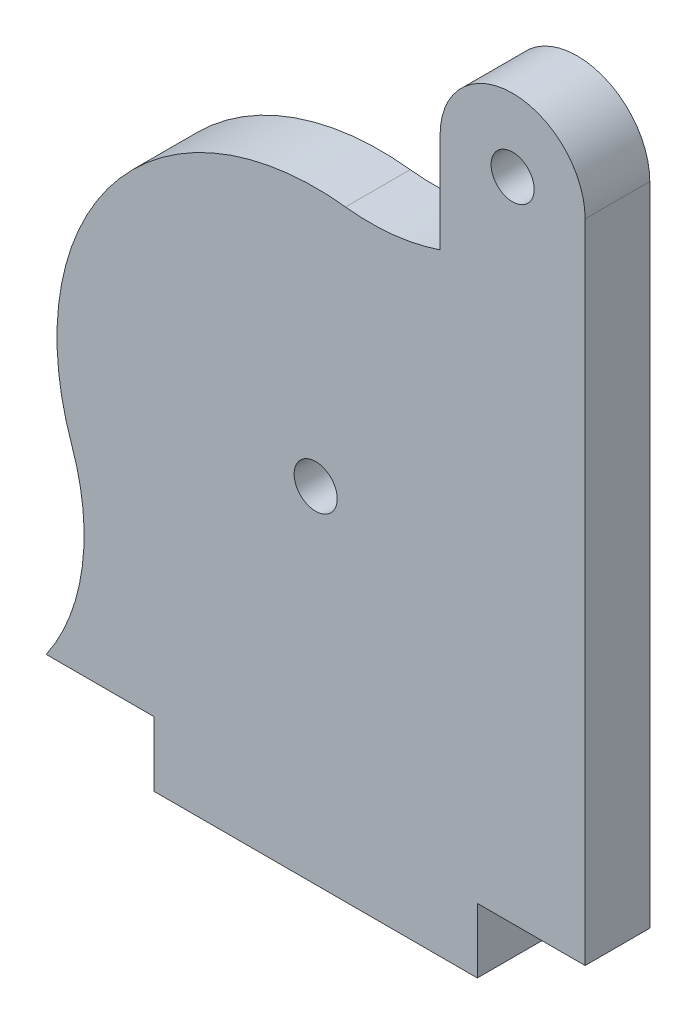
ISO-10303-21;
HEADER;
FILE_DESCRIPTION(('STEP AP214'),'2;1');
FILE_NAME('part.step','',(''),(''),'','','');
FILE_SCHEMA(('AUTOMOTIVE_DESIGN { 1 0 10303 214 1 1 1 1 }'));
ENDSEC;
DATA;
#1=APPLICATION_CONTEXT('core data for automotive mechanical design processes');
#2=APPLICATION_PROTOCOL_DEFINITION('international standard','automotive_design',2000,#1);
#3=PRODUCT_CONTEXT('',#1,'mechanical');
#4=PRODUCT('Part','Part','',(#3));
#5=PRODUCT_RELATED_PRODUCT_CATEGORY('part','',(#4));
#6=PRODUCT_DEFINITION_FORMATION('','',#4);
#7=PRODUCT_DEFINITION_CONTEXT('part definition',#1,'design');
#8=PRODUCT_DEFINITION('design','',#6,#7);
#9=PRODUCT_DEFINITION_SHAPE('','',#8);
#10=(LENGTH_UNIT() NAMED_UNIT(*) SI_UNIT(.MILLI.,.METRE.));
#11=(NAMED_UNIT(*) PLANE_ANGLE_UNIT() SI_UNIT($,.RADIAN.));
#12=(NAMED_UNIT(*) SI_UNIT($,.STERADIAN.) SOLID_ANGLE_UNIT());
#13=UNCERTAINTY_MEASURE_WITH_UNIT(LENGTH_MEASURE(1.E-05),#10,'distance_accuracy_value','');
#14=(GEOMETRIC_REPRESENTATION_CONTEXT(3) GLOBAL_UNCERTAINTY_ASSIGNED_CONTEXT((#13)) GLOBAL_UNIT_ASSIGNED_CONTEXT((#10,
#11,#12)) REPRESENTATION_CONTEXT('',''));
#15=CARTESIAN_POINT('',(0.,0.,0.));
#16=DIRECTION('',(0.,0.,1.));
#17=DIRECTION('',(1.,0.,0.));
#18=AXIS2_PLACEMENT_3D('',#15,#16,#17);
#19=CARTESIAN_POINT('',(12.5,13.,3.));
#20=DIRECTION('',(0.,0.,-1.));
#21=DIRECTION('',(-1.,0.,0.));
#22=AXIS2_PLACEMENT_3D('',#19,#20,#21);
#23=CYLINDRICAL_SURFACE('',#22,12.);
#24=CARTESIAN_POINT('',(12.5,13.,0.));
#25=DIRECTION('',(0.,0.,1.));
#26=DIRECTION('',(1.,0.,0.));
#27=AXIS2_PLACEMENT_3D('',#24,#25,#26);
#28=CIRCLE('',#27,12.);
#29=CARTESIAN_POINT('',(13.8870205728085,24.919571046418,0.));
#30=VERTEX_POINT('',#29);
#31=CARTESIAN_POINT('',(1.1867226858388,8.99878063424591,0.));
#32=VERTEX_POINT('',#31);
#33=EDGE_CURVE('E154',#30,#32,#28,.T.);
#34=ORIENTED_EDGE('',*,*,#33,.T.);
#35=DIRECTION('',(0.,0.,-1.));
#36=VECTOR('',#35,1.);
#37=CARTESIAN_POINT('',(1.1867226858388,8.99878063424591,3.));
#38=LINE('',#37,#36);
#39=CARTESIAN_POINT('',(1.1867226858388,8.99878063424591,3.));
#40=VERTEX_POINT('',#39);
#41=EDGE_CURVE('E52',#32,#40,#38,.F.);
#42=ORIENTED_EDGE('',*,*,#41,.T.);
#43=CARTESIAN_POINT('',(12.5,13.,3.));
#44=DIRECTION('',(0.,0.,1.));
#45=DIRECTION('',(1.,0.,0.));
#46=AXIS2_PLACEMENT_3D('',#43,#44,#45);
#47=CIRCLE('',#46,12.);
#48=CARTESIAN_POINT('',(13.8870205728085,24.919571046418,3.));
#49=VERTEX_POINT('',#48);
#50=EDGE_CURVE('E122',#49,#40,#47,.T.);
#51=ORIENTED_EDGE('',*,*,#50,.F.);
#52=DIRECTION('',(0.,0.,-1.));
#53=VECTOR('',#52,1.);
#54=CARTESIAN_POINT('',(13.8870205728085,24.919571046418,3.));
#55=LINE('',#54,#53);
#56=EDGE_CURVE('E138',#49,#30,#55,.T.);
#57=ORIENTED_EDGE('',*,*,#56,.T.);
#58=EDGE_LOOP('',(#34,#42,#51,#57));
#59=FACE_BOUND('',#58,.T.);
#60=ADVANCED_FACE('F37',(#59),#23,.T.);
#61=CARTESIAN_POINT('',(0.,0.,3.));
#62=DIRECTION('',(0.,1.,0.));
#63=DIRECTION('',(0.,0.,1.));
#64=AXIS2_PLACEMENT_3D('',#61,#62,#63);
#65=PLANE('',#64);
#66=DIRECTION('',(1.,0.,0.));
#67=VECTOR('',#66,1.);
#68=CARTESIAN_POINT('',(0.,0.,0.));
#69=LINE('',#68,#67);
#70=CARTESIAN_POINT('',(0.,0.,0.));
#71=VERTEX_POINT('',#70);
#72=CARTESIAN_POINT('',(5.,0.,0.));
#73=VERTEX_POINT('',#72);
#74=EDGE_CURVE('E205',#71,#73,#69,.T.);
#75=ORIENTED_EDGE('',*,*,#74,.T.);
#76=DIRECTION('',(0.,0.,-1.));
#77=VECTOR('',#76,1.);
#78=CARTESIAN_POINT('',(5.,0.,3.));
#79=LINE('',#78,#77);
#80=CARTESIAN_POINT('',(5.,0.,3.));
#81=VERTEX_POINT('',#80);
#82=EDGE_CURVE('E133',#81,#73,#79,.T.);
#83=ORIENTED_EDGE('',*,*,#82,.F.);
#84=DIRECTION('',(1.,0.,0.));
#85=VECTOR('',#84,1.);
#86=CARTESIAN_POINT('',(0.,0.,3.));
#87=LINE('',#86,#85);
#88=CARTESIAN_POINT('',(0.,0.,3.));
#89=VERTEX_POINT('',#88);
#90=EDGE_CURVE('E120',#89,#81,#87,.T.);
#91=ORIENTED_EDGE('',*,*,#90,.F.);
#92=DIRECTION('',(0.,0.,-1.));
#93=VECTOR('',#92,1.);
#94=CARTESIAN_POINT('',(0.,0.,3.));
#95=LINE('',#94,#93);
#96=EDGE_CURVE('E130',#89,#71,#95,.T.);
#97=ORIENTED_EDGE('',*,*,#96,.T.);
#98=EDGE_LOOP('',(#75,#83,#91,#97));
#99=FACE_BOUND('',#98,.T.);
#100=ADVANCED_FACE('F129',(#99),#65,.F.);
#101=CARTESIAN_POINT('',(5.,0.,3.));
#102=DIRECTION('',(1.,0.,0.));
#103=DIRECTION('',(0.,1.,0.));
#104=AXIS2_PLACEMENT_3D('',#101,#102,#103);
#105=PLANE('',#104);
#106=DIRECTION('',(0.,-1.,0.));
#107=VECTOR('',#106,1.);
#108=CARTESIAN_POINT('',(5.,0.,0.));
#109=LINE('',#108,#107);
#110=CARTESIAN_POINT('',(5.,-3.,0.));
#111=VERTEX_POINT('',#110);
#112=EDGE_CURVE('E199',#73,#111,#109,.T.);
#113=ORIENTED_EDGE('',*,*,#112,.T.);
#114=DIRECTION('',(0.,0.,-1.));
#115=VECTOR('',#114,1.);
#116=CARTESIAN_POINT('',(5.,-3.,3.));
#117=LINE('',#116,#115);
#118=CARTESIAN_POINT('',(5.,-3.,3.));
#119=VERTEX_POINT('',#118);
#120=EDGE_CURVE('E142',#119,#111,#117,.T.);
#121=ORIENTED_EDGE('',*,*,#120,.F.);
#122=DIRECTION('',(0.,-1.,0.));
#123=VECTOR('',#122,1.);
#124=CARTESIAN_POINT('',(5.,0.,3.));
#125=LINE('',#124,#123);
#126=EDGE_CURVE('E135',#81,#119,#125,.T.);
#127=ORIENTED_EDGE('',*,*,#126,.F.);
#128=ORIENTED_EDGE('',*,*,#82,.T.);
#129=EDGE_LOOP('',(#113,#121,#127,#128));
#130=FACE_BOUND('',#129,.T.);
#131=ADVANCED_FACE('F243',(#130),#105,.F.);
#132=CARTESIAN_POINT('',(0.,-3.,3.));
#133=DIRECTION('',(0.,1.,0.));
#134=DIRECTION('',(-1.,0.,0.));
#135=AXIS2_PLACEMENT_3D('',#132,#133,#134);
#136=PLANE('',#135);
#137=DIRECTION('',(1.,0.,0.));
#138=VECTOR('',#137,1.);
#139=CARTESIAN_POINT('',(0.,-3.,0.));
#140=LINE('',#139,#138);
#141=CARTESIAN_POINT('',(20.,-3.,0.));
#142=VERTEX_POINT('',#141);
#143=EDGE_CURVE('E194',#111,#142,#140,.T.);
#144=ORIENTED_EDGE('',*,*,#143,.T.);
#145=DIRECTION('',(0.,0.,-1.));
#146=VECTOR('',#145,1.);
#147=CARTESIAN_POINT('',(20.,-3.,3.));
#148=LINE('',#147,#146);
#149=CARTESIAN_POINT('',(20.,-3.,3.));
#150=VERTEX_POINT('',#149);
#151=EDGE_CURVE('E185',#150,#142,#148,.T.);
#152=ORIENTED_EDGE('',*,*,#151,.F.);
#153=DIRECTION('',(1.,0.,0.));
#154=VECTOR('',#153,1.);
#155=CARTESIAN_POINT('',(0.,-3.,3.));
#156=LINE('',#155,#154);
#157=EDGE_CURVE('E195',#119,#150,#156,.T.);
#158=ORIENTED_EDGE('',*,*,#157,.F.);
#159=ORIENTED_EDGE('',*,*,#120,.T.);
#160=EDGE_LOOP('',(#144,#152,#158,#159));
#161=FACE_BOUND('',#160,.T.);
#162=ADVANCED_FACE('F192',(#161),#136,.F.);
#163=CARTESIAN_POINT('',(20.,0.,3.));
#164=DIRECTION('',(-1.,0.,0.));
#165=DIRECTION('',(0.,-1.,0.));
#166=AXIS2_PLACEMENT_3D('',#163,#164,#165);
#167=PLANE('',#166);
#168=DIRECTION('',(0.,1.,0.));
#169=VECTOR('',#168,1.);
#170=CARTESIAN_POINT('',(20.,0.,0.));
#171=LINE('',#170,#169);
#172=CARTESIAN_POINT('',(20.,0.,0.));
#173=VERTEX_POINT('',#172);
#174=EDGE_CURVE('E201',#142,#173,#171,.T.);
#175=ORIENTED_EDGE('',*,*,#174,.T.);
#176=DIRECTION('',(0.,0.,-1.));
#177=VECTOR('',#176,1.);
#178=CARTESIAN_POINT('',(20.,0.,3.));
#179=LINE('',#178,#177);
#180=CARTESIAN_POINT('',(20.,0.,3.));
#181=VERTEX_POINT('',#180);
#182=EDGE_CURVE('E182',#181,#173,#179,.T.);
#183=ORIENTED_EDGE('',*,*,#182,.F.);
#184=DIRECTION('',(0.,1.,0.));
#185=VECTOR('',#184,1.);
#186=CARTESIAN_POINT('',(20.,0.,3.));
#187=LINE('',#186,#185);
#188=EDGE_CURVE('E229',#150,#181,#187,.T.);
#189=ORIENTED_EDGE('',*,*,#188,.F.);
#190=ORIENTED_EDGE('',*,*,#151,.T.);
#191=EDGE_LOOP('',(#175,#183,#189,#190));
#192=FACE_BOUND('',#191,.T.);
#193=ADVANCED_FACE('F228',(#192),#167,.F.);
#194=CARTESIAN_POINT('',(0.,0.,3.));
#195=DIRECTION('',(0.,1.,0.));
#196=DIRECTION('',(-1.,0.,0.));
#197=AXIS2_PLACEMENT_3D('',#194,#195,#196);
#198=PLANE('',#197);
#199=DIRECTION('',(1.,0.,0.));
#200=VECTOR('',#199,1.);
#201=CARTESIAN_POINT('',(0.,0.,0.));
#202=LINE('',#201,#200);
#203=CARTESIAN_POINT('',(25.,0.,0.));
#204=VERTEX_POINT('',#203);
#205=EDGE_CURVE('E203',#173,#204,#202,.T.);
#206=ORIENTED_EDGE('',*,*,#205,.T.);
#207=DIRECTION('',(0.,0.,-1.));
#208=VECTOR('',#207,1.);
#209=CARTESIAN_POINT('',(25.,0.,3.));
#210=LINE('',#209,#208);
#211=CARTESIAN_POINT('',(25.,0.,3.));
#212=VERTEX_POINT('',#211);
#213=EDGE_CURVE('E179',#212,#204,#210,.T.);
#214=ORIENTED_EDGE('',*,*,#213,.F.);
#215=DIRECTION('',(1.,0.,0.));
#216=VECTOR('',#215,1.);
#217=CARTESIAN_POINT('',(0.,0.,3.));
#218=LINE('',#217,#216);
#219=EDGE_CURVE('E224',#181,#212,#218,.T.);
#220=ORIENTED_EDGE('',*,*,#219,.F.);
#221=ORIENTED_EDGE('',*,*,#182,.T.);
#222=EDGE_LOOP('',(#206,#214,#220,#221));
#223=FACE_BOUND('',#222,.T.);
#224=ADVANCED_FACE('F223',(#223),#198,.F.);
#225=CARTESIAN_POINT('',(25.,0.,3.));
#226=DIRECTION('',(-1.,0.,0.));
#227=DIRECTION('',(0.,0.,1.));
#228=AXIS2_PLACEMENT_3D('',#225,#226,#227);
#229=PLANE('',#228);
#230=DIRECTION('',(0.,1.,0.));
#231=VECTOR('',#230,1.);
#232=CARTESIAN_POINT('',(25.,0.,0.));
#233=LINE('',#232,#231);
#234=CARTESIAN_POINT('',(25.,30.,0.));
#235=VERTEX_POINT('',#234);
#236=EDGE_CURVE('E210',#204,#235,#233,.T.);
#237=ORIENTED_EDGE('',*,*,#236,.T.);
#238=DIRECTION('',(0.,0.,-1.));
#239=VECTOR('',#238,1.);
#240=CARTESIAN_POINT('',(25.,30.,3.));
#241=LINE('',#240,#239);
#242=CARTESIAN_POINT('',(25.,30.,3.));
#243=VERTEX_POINT('',#242);
#244=EDGE_CURVE('E171',#243,#235,#241,.T.);
#245=ORIENTED_EDGE('',*,*,#244,.F.);
#246=DIRECTION('',(0.,1.,0.));
#247=VECTOR('',#246,1.);
#248=CARTESIAN_POINT('',(25.,0.,3.));
#249=LINE('',#248,#247);
#250=EDGE_CURVE('E220',#212,#243,#249,.T.);
#251=ORIENTED_EDGE('',*,*,#250,.F.);
#252=ORIENTED_EDGE('',*,*,#213,.T.);
#253=EDGE_LOOP('',(#237,#245,#251,#252));
#254=FACE_BOUND('',#253,.T.);
#255=ADVANCED_FACE('F217',(#254),#229,.F.);
#256=CARTESIAN_POINT('',(21.6356609426848,30.,3.));
#257=DIRECTION('',(0.,0.,-1.));
#258=DIRECTION('',(-1.,0.,0.));
#259=AXIS2_PLACEMENT_3D('',#256,#257,#258);
#260=CYLINDRICAL_SURFACE('',#259,3.36433905731518);
#261=CARTESIAN_POINT('',(21.6356609426848,30.,0.));
#262=DIRECTION('',(0.,0.,1.));
#263=DIRECTION('',(1.,0.,0.));
#264=AXIS2_PLACEMENT_3D('',#261,#262,#263);
#265=CIRCLE('',#264,3.36433905731518);
#266=CARTESIAN_POINT('',(18.2713218853696,30.,0.));
#267=VERTEX_POINT('',#266);
#268=EDGE_CURVE('E167',#235,#267,#265,.T.);
#269=ORIENTED_EDGE('',*,*,#268,.T.);
#270=DIRECTION('',(0.,0.,-1.));
#271=VECTOR('',#270,1.);
#272=CARTESIAN_POINT('',(18.2713218853696,30.,3.));
#273=LINE('',#272,#271);
#274=CARTESIAN_POINT('',(18.2713218853696,30.,3.));
#275=VERTEX_POINT('',#274);
#276=EDGE_CURVE('E165',#275,#267,#273,.T.);
#277=ORIENTED_EDGE('',*,*,#276,.F.);
#278=CARTESIAN_POINT('',(21.6356609426848,30.,3.));
#279=DIRECTION('',(0.,0.,1.));
#280=DIRECTION('',(1.,0.,0.));
#281=AXIS2_PLACEMENT_3D('',#278,#279,#280);
#282=CIRCLE('',#281,3.36433905731518);
#283=EDGE_CURVE('E173',#243,#275,#282,.T.);
#284=ORIENTED_EDGE('',*,*,#283,.F.);
#285=ORIENTED_EDGE('',*,*,#244,.T.);
#286=EDGE_LOOP('',(#269,#277,#284,#285));
#287=FACE_BOUND('',#286,.T.);
#288=ADVANCED_FACE('F212',(#287),#260,.T.);
#289=CARTESIAN_POINT('',(21.6356609426848,30.,3.));
#290=DIRECTION('',(0.,0.,-1.));
#291=DIRECTION('',(-1.,0.,0.));
#292=AXIS2_PLACEMENT_3D('',#289,#290,#291);
#293=CYLINDRICAL_SURFACE('',#292,1.);
#294=CARTESIAN_POINT('',(21.6356609426848,30.,3.));
#295=DIRECTION('',(0.,0.,1.));
#296=DIRECTION('',(1.,0.,0.));
#297=AXIS2_PLACEMENT_3D('',#294,#295,#296);
#298=CIRCLE('',#297,1.);
#299=CARTESIAN_POINT('',(22.6356609426848,30.,3.));
#300=VERTEX_POINT('',#299);
#301=EDGE_CURVE('E246',#300,#300,#298,.T.);
#302=ORIENTED_EDGE('',*,*,#301,.T.);
#303=EDGE_LOOP('',(#302));
#304=FACE_BOUND('',#303,.T.);
#305=CARTESIAN_POINT('',(21.6356609426848,30.,0.));
#306=DIRECTION('',(0.,0.,1.));
#307=DIRECTION('',(1.,0.,0.));
#308=AXIS2_PLACEMENT_3D('',#305,#306,#307);
#309=CIRCLE('',#308,1.);
#310=CARTESIAN_POINT('',(22.6356609426848,30.,0.));
#311=VERTEX_POINT('',#310);
#312=EDGE_CURVE('E240',#311,#311,#309,.T.);
#313=ORIENTED_EDGE('',*,*,#312,.F.);
#314=EDGE_LOOP('',(#313));
#315=FACE_BOUND('',#314,.T.);
#316=ADVANCED_FACE('F260',(#304,#315),#293,.F.);
#317=CARTESIAN_POINT('',(12.5,13.,3.));
#318=DIRECTION('',(0.,0.,-1.));
#319=DIRECTION('',(-1.,0.,0.));
#320=AXIS2_PLACEMENT_3D('',#317,#318,#319);
#321=CYLINDRICAL_SURFACE('',#320,0.999999999999999);
#322=CARTESIAN_POINT('',(12.5,13.,3.));
#323=DIRECTION('',(0.,0.,1.));
#324=DIRECTION('',(1.,0.,0.));
#325=AXIS2_PLACEMENT_3D('',#322,#323,#324);
#326=CIRCLE('',#325,0.999999999999999);
#327=CARTESIAN_POINT('',(13.5,13.,3.));
#328=VERTEX_POINT('',#327);
#329=EDGE_CURVE('E166',#328,#328,#326,.T.);
#330=ORIENTED_EDGE('',*,*,#329,.T.);
#331=EDGE_LOOP('',(#330));
#332=FACE_BOUND('',#331,.T.);
#333=CARTESIAN_POINT('',(12.5,13.,0.));
#334=DIRECTION('',(0.,0.,1.));
#335=DIRECTION('',(1.,0.,0.));
#336=AXIS2_PLACEMENT_3D('',#333,#334,#335);
#337=CIRCLE('',#336,0.999999999999999);
#338=CARTESIAN_POINT('',(13.5,13.,0.));
#339=VERTEX_POINT('',#338);
#340=EDGE_CURVE('E237',#339,#339,#337,.T.);
#341=ORIENTED_EDGE('',*,*,#340,.F.);
#342=EDGE_LOOP('',(#341));
#343=FACE_BOUND('',#342,.T.);
#344=ADVANCED_FACE('F252',(#332,#343),#321,.F.);
#345=CARTESIAN_POINT('',(18.2713218853697,0.,3.));
#346=DIRECTION('',(1.,0.,0.));
#347=DIRECTION('',(0.,1.,0.));
#348=AXIS2_PLACEMENT_3D('',#345,#346,#347);
#349=PLANE('',#348);
#350=DIRECTION('',(0.,-1.,0.));
#351=VECTOR('',#350,1.);
#352=CARTESIAN_POINT('',(18.2713218853697,0.,0.));
#353=LINE('',#352,#351);
#354=CARTESIAN_POINT('',(18.2713218853696,25.3880286948485,0.));
#355=VERTEX_POINT('',#354);
#356=EDGE_CURVE('E153',#267,#355,#353,.T.);
#357=ORIENTED_EDGE('',*,*,#356,.T.);
#358=DIRECTION('',(0.,0.,-1.));
#359=VECTOR('',#358,1.);
#360=CARTESIAN_POINT('',(18.2713218853696,25.3880286948485,3.));
#361=LINE('',#360,#359);
#362=CARTESIAN_POINT('',(18.2713218853696,25.3880286948485,3.));
#363=VERTEX_POINT('',#362);
#364=EDGE_CURVE('E163',#363,#355,#361,.T.);
#365=ORIENTED_EDGE('',*,*,#364,.F.);
#366=DIRECTION('',(0.,-1.,0.));
#367=VECTOR('',#366,1.);
#368=CARTESIAN_POINT('',(18.2713218853697,0.,3.));
#369=LINE('',#368,#367);
#370=EDGE_CURVE('E169',#275,#363,#369,.T.);
#371=ORIENTED_EDGE('',*,*,#370,.F.);
#372=ORIENTED_EDGE('',*,*,#276,.T.);
#373=EDGE_LOOP('',(#357,#365,#371,#372));
#374=FACE_BOUND('',#373,.T.);
#375=ADVANCED_FACE('F161',(#374),#349,.F.);
#376=CARTESIAN_POINT('',(0.,0.,3.));
#377=DIRECTION('',(0.,0.,1.));
#378=DIRECTION('',(1.,0.,0.));
#379=AXIS2_PLACEMENT_3D('',#376,#377,#378);
#380=PLANE('',#379);
#381=ORIENTED_EDGE('',*,*,#329,.F.);
#382=EDGE_LOOP('',(#381));
#383=FACE_BOUND('',#382,.T.);
#384=ORIENTED_EDGE('',*,*,#301,.F.);
#385=EDGE_LOOP('',(#384));
#386=FACE_BOUND('',#385,.T.);
#387=ORIENTED_EDGE('',*,*,#370,.T.);
#388=CARTESIAN_POINT('',(15.042871050149,34.852546918433,3.));
#389=DIRECTION('',(0.,0.,1.));
#390=DIRECTION('',(1.,0.,0.));
#391=AXIS2_PLACEMENT_3D('',#388,#389,#390);
#392=CIRCLE('',#391,10.);
#393=EDGE_CURVE('E11',#363,#49,#392,.F.);
#394=ORIENTED_EDGE('',*,*,#393,.T.);
#395=ORIENTED_EDGE('',*,*,#50,.T.);
#396=CARTESIAN_POINT('',(-8.24100840929553,5.66443116278416,3.));
#397=DIRECTION('',(0.,0.,1.));
#398=DIRECTION('',(1.,0.,0.));
#399=AXIS2_PLACEMENT_3D('',#396,#397,#398);
#400=CIRCLE('',#399,10.);
#401=EDGE_CURVE('E117',#40,#89,#400,.F.);
#402=ORIENTED_EDGE('',*,*,#401,.T.);
#403=ORIENTED_EDGE('',*,*,#90,.T.);
#404=ORIENTED_EDGE('',*,*,#126,.T.);
#405=ORIENTED_EDGE('',*,*,#157,.T.);
#406=ORIENTED_EDGE('',*,*,#188,.T.);
#407=ORIENTED_EDGE('',*,*,#219,.T.);
#408=ORIENTED_EDGE('',*,*,#250,.T.);
#409=ORIENTED_EDGE('',*,*,#283,.T.);
#410=EDGE_LOOP('',(#387,#394,#395,#402,#403,#404,#405,#406,#407,#408,#409));
#411=FACE_BOUND('',#410,.T.);
#412=ADVANCED_FACE('F119',(#383,#386,#411),#380,.T.);
#413=CARTESIAN_POINT('',(0.,0.,0.));
#414=DIRECTION('',(0.,0.,1.));
#415=DIRECTION('',(1.,0.,0.));
#416=AXIS2_PLACEMENT_3D('',#413,#414,#415);
#417=PLANE('',#416);
#418=ORIENTED_EDGE('',*,*,#340,.T.);
#419=EDGE_LOOP('',(#418));
#420=FACE_BOUND('',#419,.T.);
#421=ORIENTED_EDGE('',*,*,#312,.T.);
#422=EDGE_LOOP('',(#421));
#423=FACE_BOUND('',#422,.T.);
#424=ORIENTED_EDGE('',*,*,#33,.F.);
#425=CARTESIAN_POINT('',(15.042871050149,34.852546918433,0.));
#426=DIRECTION('',(0.,0.,1.));
#427=DIRECTION('',(1.,0.,0.));
#428=AXIS2_PLACEMENT_3D('',#425,#426,#427);
#429=CIRCLE('',#428,10.);
#430=EDGE_CURVE('E45',#30,#355,#429,.T.);
#431=ORIENTED_EDGE('',*,*,#430,.T.);
#432=ORIENTED_EDGE('',*,*,#356,.F.);
#433=ORIENTED_EDGE('',*,*,#268,.F.);
#434=ORIENTED_EDGE('',*,*,#236,.F.);
#435=ORIENTED_EDGE('',*,*,#205,.F.);
#436=ORIENTED_EDGE('',*,*,#174,.F.);
#437=ORIENTED_EDGE('',*,*,#143,.F.);
#438=ORIENTED_EDGE('',*,*,#112,.F.);
#439=ORIENTED_EDGE('',*,*,#74,.F.);
#440=CARTESIAN_POINT('',(-8.24100840929553,5.66443116278416,0.));
#441=DIRECTION('',(0.,0.,1.));
#442=DIRECTION('',(1.,0.,0.));
#443=AXIS2_PLACEMENT_3D('',#440,#441,#442);
#444=CIRCLE('',#443,10.);
#445=EDGE_CURVE('E125',#71,#32,#444,.T.);
#446=ORIENTED_EDGE('',*,*,#445,.T.);
#447=EDGE_LOOP('',(#424,#431,#432,#433,#434,#435,#436,#437,#438,#439,#446));
#448=FACE_BOUND('',#447,.T.);
#449=ADVANCED_FACE('F151',(#420,#423,#448),#417,.F.);
#450=CARTESIAN_POINT('',(-8.24100840929553,5.66443116278416,3.));
#451=DIRECTION('',(0.,0.,1.));
#452=DIRECTION('',(1.,0.,0.));
#453=AXIS2_PLACEMENT_3D('',#450,#451,#452);
#454=CYLINDRICAL_SURFACE('',#453,10.);
#455=ORIENTED_EDGE('',*,*,#401,.F.);
#456=ORIENTED_EDGE('',*,*,#41,.F.);
#457=ORIENTED_EDGE('',*,*,#445,.F.);
#458=ORIENTED_EDGE('',*,*,#96,.F.);
#459=EDGE_LOOP('',(#455,#456,#457,#458));
#460=FACE_BOUND('',#459,.T.);
#461=ADVANCED_FACE('F137',(#460),#454,.F.);
#462=CARTESIAN_POINT('',(15.042871050149,34.852546918433,3.));
#463=DIRECTION('',(0.,0.,1.));
#464=DIRECTION('',(1.,0.,0.));
#465=AXIS2_PLACEMENT_3D('',#462,#463,#464);
#466=CYLINDRICAL_SURFACE('',#465,10.);
#467=ORIENTED_EDGE('',*,*,#393,.F.);
#468=ORIENTED_EDGE('',*,*,#364,.T.);
#469=ORIENTED_EDGE('',*,*,#430,.F.);
#470=ORIENTED_EDGE('',*,*,#56,.F.);
#471=EDGE_LOOP('',(#467,#468,#469,#470));
#472=FACE_BOUND('',#471,.T.);
#473=ADVANCED_FACE('F39',(#472),#466,.F.);
#474=CLOSED_SHELL('',(#60,#100,#131,#162,#193,#224,#255,#288,#316,#344,#375,#412,#449,#461,#473));
#475=MANIFOLD_SOLID_BREP('B2',#474);
#476=ADVANCED_BREP_SHAPE_REPRESENTATION('',(#18,#475),#14);
#477=SHAPE_DEFINITION_REPRESENTATION(#9,#476);
ENDSEC;
END-ISO-10303-21;
